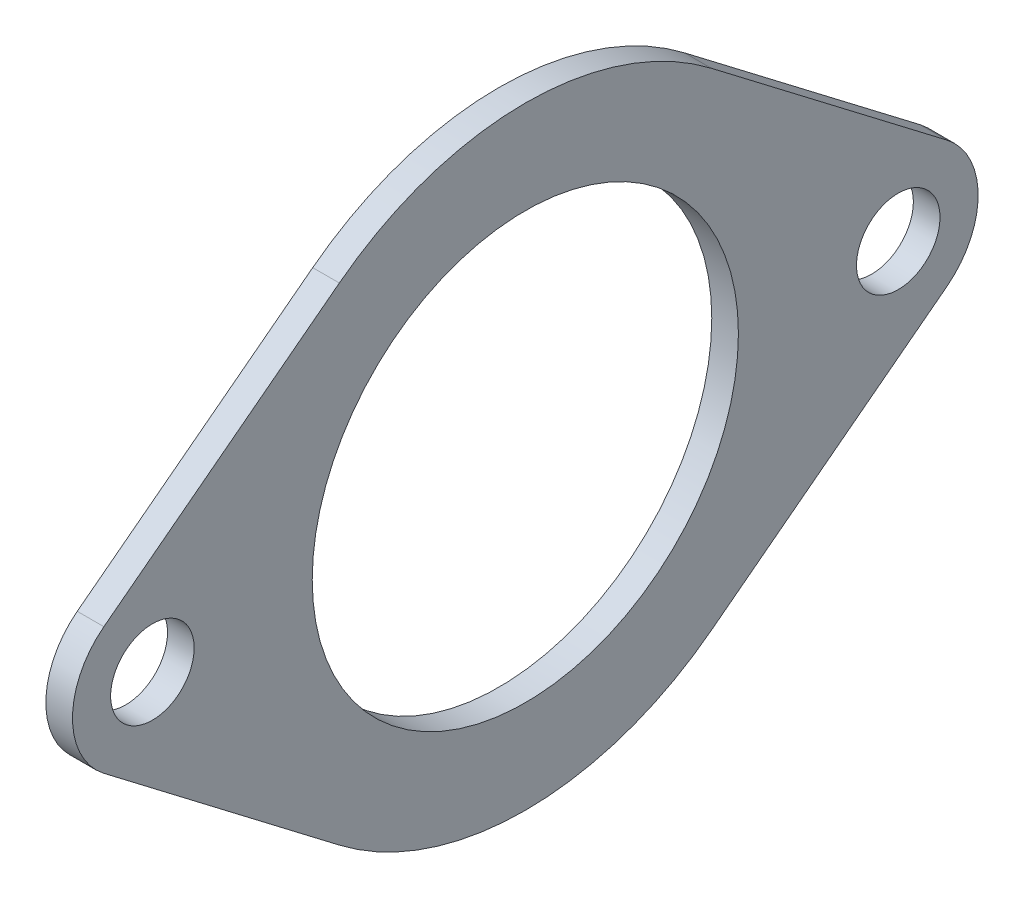
ISO-10303-21;
HEADER;
FILE_DESCRIPTION(('STEP AP214'),'2;1');
FILE_NAME('part.step','',(''),(''),'','','');
FILE_SCHEMA(('AUTOMOTIVE_DESIGN { 1 0 10303 214 1 1 1 1 }'));
ENDSEC;
DATA;
#1=APPLICATION_CONTEXT('core data for automotive mechanical design processes');
#2=APPLICATION_PROTOCOL_DEFINITION('international standard','automotive_design',2000,#1);
#3=PRODUCT_CONTEXT('',#1,'mechanical');
#4=PRODUCT('Part','Part','',(#3));
#5=PRODUCT_RELATED_PRODUCT_CATEGORY('part','',(#4));
#6=PRODUCT_DEFINITION_FORMATION('','',#4);
#7=PRODUCT_DEFINITION_CONTEXT('part definition',#1,'design');
#8=PRODUCT_DEFINITION('design','',#6,#7);
#9=PRODUCT_DEFINITION_SHAPE('','',#8);
#10=(LENGTH_UNIT() NAMED_UNIT(*) SI_UNIT(.MILLI.,.METRE.));
#11=(NAMED_UNIT(*) PLANE_ANGLE_UNIT() SI_UNIT($,.RADIAN.));
#12=(NAMED_UNIT(*) SI_UNIT($,.STERADIAN.) SOLID_ANGLE_UNIT());
#13=UNCERTAINTY_MEASURE_WITH_UNIT(LENGTH_MEASURE(1.E-05),#10,'distance_accuracy_value','');
#14=(GEOMETRIC_REPRESENTATION_CONTEXT(3) GLOBAL_UNCERTAINTY_ASSIGNED_CONTEXT((#13)) GLOBAL_UNIT_ASSIGNED_CONTEXT((#10,
#11,#12)) REPRESENTATION_CONTEXT('',''));
#15=CARTESIAN_POINT('',(0.,0.,0.));
#16=DIRECTION('',(0.,0.,1.));
#17=DIRECTION('',(1.,0.,0.));
#18=AXIS2_PLACEMENT_3D('',#15,#16,#17);
#19=CARTESIAN_POINT('',(0.79375,0.,22.225));
#20=DIRECTION('',(1.,0.,0.));
#21=DIRECTION('',(0.,0.,-1.));
#22=AXIS2_PLACEMENT_3D('',#19,#20,#21);
#23=PLANE('',#22);
#24=CARTESIAN_POINT('',(0.79375,0.,-22.225));
#25=DIRECTION('',(1.,0.,0.));
#26=DIRECTION('',(0.,0.,-1.));
#27=AXIS2_PLACEMENT_3D('',#24,#25,#26);
#28=CIRCLE('',#27,2.4892);
#29=CARTESIAN_POINT('',(0.79375,0.,-24.7142));
#30=VERTEX_POINT('',#29);
#31=EDGE_CURVE('E186',#30,#30,#28,.T.);
#32=ORIENTED_EDGE('',*,*,#31,.F.);
#33=EDGE_LOOP('',(#32));
#34=FACE_BOUND('',#33,.T.);
#35=CARTESIAN_POINT('',(0.79375,0.,22.225));
#36=DIRECTION('',(1.,0.,0.));
#37=DIRECTION('',(0.,0.,-1.));
#38=AXIS2_PLACEMENT_3D('',#35,#36,#37);
#39=CIRCLE('',#38,4.7625);
#40=CARTESIAN_POINT('',(0.79375,3.7842477101564,25.1165178571429));
#41=VERTEX_POINT('',#40);
#42=CARTESIAN_POINT('',(0.79375,-3.78424771015641,25.1165178571429));
#43=VERTEX_POINT('',#42);
#44=EDGE_CURVE('E149',#41,#43,#39,.T.);
#45=ORIENTED_EDGE('',*,*,#44,.T.);
#46=DIRECTION('',(0.,-0.607142857142857,-0.794592695045964));
#47=VECTOR('',#46,1.);
#48=CARTESIAN_POINT('',(0.79375,-3.78424771015641,25.1165178571429));
#49=LINE('',#48,#47);
#50=CARTESIAN_POINT('',(0.79375,-14.5062828889329,11.0841517857143));
#51=VERTEX_POINT('',#50);
#52=EDGE_CURVE('E97',#43,#51,#49,.T.);
#53=ORIENTED_EDGE('',*,*,#52,.T.);
#54=CARTESIAN_POINT('',(0.79375,0.,0.));
#55=DIRECTION('',(1.,0.,0.));
#56=DIRECTION('',(0.,0.,-1.));
#57=AXIS2_PLACEMENT_3D('',#54,#55,#56);
#58=CIRCLE('',#57,18.25625);
#59=CARTESIAN_POINT('',(0.79375,-14.5062828889329,-11.0841517857143));
#60=VERTEX_POINT('',#59);
#61=EDGE_CURVE('E164',#51,#60,#58,.T.);
#62=ORIENTED_EDGE('',*,*,#61,.T.);
#63=DIRECTION('',(0.,0.607142857142857,-0.794592695045964));
#64=VECTOR('',#63,1.);
#65=CARTESIAN_POINT('',(0.79375,-3.78424771015639,-25.1165178571429));
#66=LINE('',#65,#64);
#67=CARTESIAN_POINT('',(0.79375,-3.78424771015639,-25.1165178571429));
#68=VERTEX_POINT('',#67);
#69=EDGE_CURVE('E177',#60,#68,#66,.T.);
#70=ORIENTED_EDGE('',*,*,#69,.T.);
#71=CARTESIAN_POINT('',(0.79375,0.,-22.225));
#72=DIRECTION('',(1.,0.,0.));
#73=DIRECTION('',(0.,0.,-1.));
#74=AXIS2_PLACEMENT_3D('',#71,#72,#73);
#75=CIRCLE('',#74,4.7625);
#76=CARTESIAN_POINT('',(0.79375,3.78424771015641,-25.1165178571429));
#77=VERTEX_POINT('',#76);
#78=EDGE_CURVE('E116',#68,#77,#75,.T.);
#79=ORIENTED_EDGE('',*,*,#78,.T.);
#80=DIRECTION('',(0.,0.607142857142857,0.794592695045964));
#81=VECTOR('',#80,1.);
#82=CARTESIAN_POINT('',(0.79375,3.78424771015641,-25.1165178571429));
#83=LINE('',#82,#81);
#84=CARTESIAN_POINT('',(0.79375,14.5062828889329,-11.0841517857143));
#85=VERTEX_POINT('',#84);
#86=EDGE_CURVE('E110',#77,#85,#83,.T.);
#87=ORIENTED_EDGE('',*,*,#86,.T.);
#88=CARTESIAN_POINT('',(0.79375,0.,0.));
#89=DIRECTION('',(1.,0.,0.));
#90=DIRECTION('',(0.,0.,-1.));
#91=AXIS2_PLACEMENT_3D('',#88,#89,#90);
#92=CIRCLE('',#91,18.25625);
#93=CARTESIAN_POINT('',(0.79375,14.5062828889329,11.0841517857143));
#94=VERTEX_POINT('',#93);
#95=EDGE_CURVE('E114',#85,#94,#92,.T.);
#96=ORIENTED_EDGE('',*,*,#95,.T.);
#97=DIRECTION('',(0.,-0.607142857142857,0.794592695045964));
#98=VECTOR('',#97,1.);
#99=CARTESIAN_POINT('',(0.79375,3.7842477101564,25.1165178571429));
#100=LINE('',#99,#98);
#101=EDGE_CURVE('E54',#94,#41,#100,.T.);
#102=ORIENTED_EDGE('',*,*,#101,.T.);
#103=EDGE_LOOP('',(#45,#53,#62,#70,#79,#87,#96,#102));
#104=FACE_BOUND('',#103,.T.);
#105=CARTESIAN_POINT('',(0.79375,0.,0.));
#106=DIRECTION('',(1.,0.,0.));
#107=DIRECTION('',(0.,0.,-1.));
#108=AXIS2_PLACEMENT_3D('',#105,#106,#107);
#109=CIRCLE('',#108,12.7);
#110=CARTESIAN_POINT('',(0.79375,0.,-12.7));
#111=VERTEX_POINT('',#110);
#112=EDGE_CURVE('E138',#111,#111,#109,.T.);
#113=ORIENTED_EDGE('',*,*,#112,.F.);
#114=EDGE_LOOP('',(#113));
#115=FACE_BOUND('',#114,.T.);
#116=CARTESIAN_POINT('',(0.79375,0.,22.225));
#117=DIRECTION('',(1.,0.,0.));
#118=DIRECTION('',(0.,0.,-1.));
#119=AXIS2_PLACEMENT_3D('',#116,#117,#118);
#120=CIRCLE('',#119,2.4892);
#121=CARTESIAN_POINT('',(0.79375,0.,19.7358));
#122=VERTEX_POINT('',#121);
#123=EDGE_CURVE('E192',#122,#122,#120,.T.);
#124=ORIENTED_EDGE('',*,*,#123,.F.);
#125=EDGE_LOOP('',(#124));
#126=FACE_BOUND('',#125,.T.);
#127=ADVANCED_FACE('F37',(#34,#104,#115,#126),#23,.T.);
#128=CARTESIAN_POINT('',(-0.79375,0.,22.225));
#129=DIRECTION('',(1.,0.,0.));
#130=DIRECTION('',(0.,0.,-1.));
#131=AXIS2_PLACEMENT_3D('',#128,#129,#130);
#132=PLANE('',#131);
#133=CARTESIAN_POINT('',(-0.79375,0.,22.225));
#134=DIRECTION('',(1.,0.,0.));
#135=DIRECTION('',(0.,0.,-1.));
#136=AXIS2_PLACEMENT_3D('',#133,#134,#135);
#137=CIRCLE('',#136,4.7625);
#138=CARTESIAN_POINT('',(-0.79375,3.7842477101564,25.1165178571429));
#139=VERTEX_POINT('',#138);
#140=CARTESIAN_POINT('',(-0.79375,-3.78424771015641,25.1165178571429));
#141=VERTEX_POINT('',#140);
#142=EDGE_CURVE('E134',#139,#141,#137,.T.);
#143=ORIENTED_EDGE('',*,*,#142,.F.);
#144=DIRECTION('',(0.,-0.607142857142857,0.794592695045964));
#145=VECTOR('',#144,1.);
#146=CARTESIAN_POINT('',(-0.79375,3.7842477101564,25.1165178571429));
#147=LINE('',#146,#145);
#148=CARTESIAN_POINT('',(-0.79375,14.5062828889329,11.0841517857143));
#149=VERTEX_POINT('',#148);
#150=EDGE_CURVE('E89',#149,#139,#147,.T.);
#151=ORIENTED_EDGE('',*,*,#150,.F.);
#152=CARTESIAN_POINT('',(-0.79375,0.,0.));
#153=DIRECTION('',(1.,0.,0.));
#154=DIRECTION('',(0.,0.,-1.));
#155=AXIS2_PLACEMENT_3D('',#152,#153,#154);
#156=CIRCLE('',#155,18.25625);
#157=CARTESIAN_POINT('',(-0.79375,14.5062828889329,-11.0841517857143));
#158=VERTEX_POINT('',#157);
#159=EDGE_CURVE('E83',#158,#149,#156,.T.);
#160=ORIENTED_EDGE('',*,*,#159,.F.);
#161=DIRECTION('',(0.,0.607142857142857,0.794592695045964));
#162=VECTOR('',#161,1.);
#163=CARTESIAN_POINT('',(-0.79375,3.78424771015641,-25.1165178571429));
#164=LINE('',#163,#162);
#165=CARTESIAN_POINT('',(-0.79375,3.78424771015641,-25.1165178571429));
#166=VERTEX_POINT('',#165);
#167=EDGE_CURVE('E124',#166,#158,#164,.T.);
#168=ORIENTED_EDGE('',*,*,#167,.F.);
#169=CARTESIAN_POINT('',(-0.79375,0.,-22.225));
#170=DIRECTION('',(1.,0.,0.));
#171=DIRECTION('',(0.,0.,-1.));
#172=AXIS2_PLACEMENT_3D('',#169,#170,#171);
#173=CIRCLE('',#172,4.7625);
#174=CARTESIAN_POINT('',(-0.79375,-3.78424771015639,-25.1165178571429));
#175=VERTEX_POINT('',#174);
#176=EDGE_CURVE('E144',#175,#166,#173,.T.);
#177=ORIENTED_EDGE('',*,*,#176,.F.);
#178=DIRECTION('',(0.,0.607142857142857,-0.794592695045964));
#179=VECTOR('',#178,1.);
#180=CARTESIAN_POINT('',(-0.79375,-3.78424771015639,-25.1165178571429));
#181=LINE('',#180,#179);
#182=CARTESIAN_POINT('',(-0.79375,-14.5062828889329,-11.0841517857143));
#183=VERTEX_POINT('',#182);
#184=EDGE_CURVE('E142',#183,#175,#181,.T.);
#185=ORIENTED_EDGE('',*,*,#184,.F.);
#186=CARTESIAN_POINT('',(-0.79375,0.,0.));
#187=DIRECTION('',(1.,0.,0.));
#188=DIRECTION('',(0.,0.,-1.));
#189=AXIS2_PLACEMENT_3D('',#186,#187,#188);
#190=CIRCLE('',#189,18.25625);
#191=CARTESIAN_POINT('',(-0.79375,-14.5062828889329,11.0841517857143));
#192=VERTEX_POINT('',#191);
#193=EDGE_CURVE('E140',#192,#183,#190,.T.);
#194=ORIENTED_EDGE('',*,*,#193,.F.);
#195=DIRECTION('',(0.,-0.607142857142857,-0.794592695045964));
#196=VECTOR('',#195,1.);
#197=CARTESIAN_POINT('',(-0.79375,-3.78424771015641,25.1165178571429));
#198=LINE('',#197,#196);
#199=EDGE_CURVE('E137',#141,#192,#198,.T.);
#200=ORIENTED_EDGE('',*,*,#199,.F.);
#201=EDGE_LOOP('',(#143,#151,#160,#168,#177,#185,#194,#200));
#202=FACE_BOUND('',#201,.T.);
#203=CARTESIAN_POINT('',(-0.79375,0.,0.));
#204=DIRECTION('',(1.,0.,0.));
#205=DIRECTION('',(0.,0.,-1.));
#206=AXIS2_PLACEMENT_3D('',#203,#204,#205);
#207=CIRCLE('',#206,12.7);
#208=CARTESIAN_POINT('',(-0.79375,0.,-12.7));
#209=VERTEX_POINT('',#208);
#210=EDGE_CURVE('E183',#209,#209,#207,.T.);
#211=ORIENTED_EDGE('',*,*,#210,.T.);
#212=EDGE_LOOP('',(#211));
#213=FACE_BOUND('',#212,.T.);
#214=CARTESIAN_POINT('',(-0.79375,0.,-22.225));
#215=DIRECTION('',(1.,0.,0.));
#216=DIRECTION('',(0.,0.,-1.));
#217=AXIS2_PLACEMENT_3D('',#214,#215,#216);
#218=CIRCLE('',#217,2.4892);
#219=CARTESIAN_POINT('',(-0.79375,0.,-24.7142));
#220=VERTEX_POINT('',#219);
#221=EDGE_CURVE('E189',#220,#220,#218,.T.);
#222=ORIENTED_EDGE('',*,*,#221,.T.);
#223=EDGE_LOOP('',(#222));
#224=FACE_BOUND('',#223,.T.);
#225=CARTESIAN_POINT('',(-0.79375,0.,22.225));
#226=DIRECTION('',(1.,0.,0.));
#227=DIRECTION('',(0.,0.,-1.));
#228=AXIS2_PLACEMENT_3D('',#225,#226,#227);
#229=CIRCLE('',#228,2.4892);
#230=CARTESIAN_POINT('',(-0.79375,0.,19.7358));
#231=VERTEX_POINT('',#230);
#232=EDGE_CURVE('E195',#231,#231,#229,.T.);
#233=ORIENTED_EDGE('',*,*,#232,.T.);
#234=EDGE_LOOP('',(#233));
#235=FACE_BOUND('',#234,.T.);
#236=ADVANCED_FACE('F168',(#202,#213,#224,#235),#132,.F.);
#237=CARTESIAN_POINT('',(0.79375,0.,22.225));
#238=DIRECTION('',(-1.,0.,0.));
#239=DIRECTION('',(0.,0.,1.));
#240=AXIS2_PLACEMENT_3D('',#237,#238,#239);
#241=CYLINDRICAL_SURFACE('',#240,4.7625);
#242=ORIENTED_EDGE('',*,*,#142,.T.);
#243=DIRECTION('',(-1.,0.,0.));
#244=VECTOR('',#243,1.);
#245=CARTESIAN_POINT('',(0.79375,-3.78424771015641,25.1165178571429));
#246=LINE('',#245,#244);
#247=EDGE_CURVE('E11',#43,#141,#246,.T.);
#248=ORIENTED_EDGE('',*,*,#247,.F.);
#249=ORIENTED_EDGE('',*,*,#44,.F.);
#250=DIRECTION('',(-1.,0.,0.));
#251=VECTOR('',#250,1.);
#252=CARTESIAN_POINT('',(0.79375,3.7842477101564,25.1165178571429));
#253=LINE('',#252,#251);
#254=EDGE_CURVE('E130',#41,#139,#253,.T.);
#255=ORIENTED_EDGE('',*,*,#254,.T.);
#256=EDGE_LOOP('',(#242,#248,#249,#255));
#257=FACE_BOUND('',#256,.T.);
#258=ADVANCED_FACE('F39',(#257),#241,.T.);
#259=CARTESIAN_POINT('',(0.79375,-3.78424771015641,25.1165178571429));
#260=DIRECTION('',(0.,0.794592695045964,-0.607142857142857));
#261=DIRECTION('',(0.,0.607142857142857,0.794592695045964));
#262=AXIS2_PLACEMENT_3D('',#259,#260,#261);
#263=PLANE('',#262);
#264=ORIENTED_EDGE('',*,*,#199,.T.);
#265=DIRECTION('',(-1.,0.,0.));
#266=VECTOR('',#265,1.);
#267=CARTESIAN_POINT('',(0.79375,-14.5062828889329,11.0841517857143));
#268=LINE('',#267,#266);
#269=EDGE_CURVE('E46',#51,#192,#268,.T.);
#270=ORIENTED_EDGE('',*,*,#269,.F.);
#271=ORIENTED_EDGE('',*,*,#52,.F.);
#272=ORIENTED_EDGE('',*,*,#247,.T.);
#273=EDGE_LOOP('',(#264,#270,#271,#272));
#274=FACE_BOUND('',#273,.T.);
#275=ADVANCED_FACE('F228',(#274),#263,.F.);
#276=CARTESIAN_POINT('',(0.79375,0.,0.));
#277=DIRECTION('',(-1.,0.,0.));
#278=DIRECTION('',(0.,0.,1.));
#279=AXIS2_PLACEMENT_3D('',#276,#277,#278);
#280=CYLINDRICAL_SURFACE('',#279,18.25625);
#281=ORIENTED_EDGE('',*,*,#193,.T.);
#282=DIRECTION('',(-1.,0.,0.));
#283=VECTOR('',#282,1.);
#284=CARTESIAN_POINT('',(0.79375,-14.5062828889329,-11.0841517857143));
#285=LINE('',#284,#283);
#286=EDGE_CURVE('E156',#60,#183,#285,.T.);
#287=ORIENTED_EDGE('',*,*,#286,.F.);
#288=ORIENTED_EDGE('',*,*,#61,.F.);
#289=ORIENTED_EDGE('',*,*,#269,.T.);
#290=EDGE_LOOP('',(#281,#287,#288,#289));
#291=FACE_BOUND('',#290,.T.);
#292=ADVANCED_FACE('F162',(#291),#280,.T.);
#293=CARTESIAN_POINT('',(0.79375,-3.78424771015639,-25.1165178571429));
#294=DIRECTION('',(0.,0.794592695045964,0.607142857142857));
#295=DIRECTION('',(0.,-0.607142857142857,0.794592695045964));
#296=AXIS2_PLACEMENT_3D('',#293,#294,#295);
#297=PLANE('',#296);
#298=ORIENTED_EDGE('',*,*,#184,.T.);
#299=DIRECTION('',(-1.,0.,0.));
#300=VECTOR('',#299,1.);
#301=CARTESIAN_POINT('',(0.79375,-3.78424771015639,-25.1165178571429));
#302=LINE('',#301,#300);
#303=EDGE_CURVE('E153',#68,#175,#302,.T.);
#304=ORIENTED_EDGE('',*,*,#303,.F.);
#305=ORIENTED_EDGE('',*,*,#69,.F.);
#306=ORIENTED_EDGE('',*,*,#286,.T.);
#307=EDGE_LOOP('',(#298,#304,#305,#306));
#308=FACE_BOUND('',#307,.T.);
#309=ADVANCED_FACE('F173',(#308),#297,.F.);
#310=CARTESIAN_POINT('',(0.79375,0.,-22.225));
#311=DIRECTION('',(-1.,0.,0.));
#312=DIRECTION('',(0.,0.,1.));
#313=AXIS2_PLACEMENT_3D('',#310,#311,#312);
#314=CYLINDRICAL_SURFACE('',#313,4.7625);
#315=ORIENTED_EDGE('',*,*,#176,.T.);
#316=DIRECTION('',(-1.,0.,0.));
#317=VECTOR('',#316,1.);
#318=CARTESIAN_POINT('',(0.79375,3.78424771015641,-25.1165178571429));
#319=LINE('',#318,#317);
#320=EDGE_CURVE('E125',#77,#166,#319,.T.);
#321=ORIENTED_EDGE('',*,*,#320,.F.);
#322=ORIENTED_EDGE('',*,*,#78,.F.);
#323=ORIENTED_EDGE('',*,*,#303,.T.);
#324=EDGE_LOOP('',(#315,#321,#322,#323));
#325=FACE_BOUND('',#324,.T.);
#326=ADVANCED_FACE('F176',(#325),#314,.T.);
#327=CARTESIAN_POINT('',(0.79375,3.78424771015641,-25.1165178571429));
#328=DIRECTION('',(0.,-0.794592695045964,0.607142857142857));
#329=DIRECTION('',(0.,-0.607142857142857,-0.794592695045964));
#330=AXIS2_PLACEMENT_3D('',#327,#328,#329);
#331=PLANE('',#330);
#332=ORIENTED_EDGE('',*,*,#167,.T.);
#333=DIRECTION('',(-1.,0.,0.));
#334=VECTOR('',#333,1.);
#335=CARTESIAN_POINT('',(0.79375,14.5062828889329,-11.0841517857143));
#336=LINE('',#335,#334);
#337=EDGE_CURVE('E121',#85,#158,#336,.T.);
#338=ORIENTED_EDGE('',*,*,#337,.F.);
#339=ORIENTED_EDGE('',*,*,#86,.F.);
#340=ORIENTED_EDGE('',*,*,#320,.T.);
#341=EDGE_LOOP('',(#332,#338,#339,#340));
#342=FACE_BOUND('',#341,.T.);
#343=ADVANCED_FACE('F122',(#342),#331,.F.);
#344=CARTESIAN_POINT('',(0.79375,0.,0.));
#345=DIRECTION('',(-1.,0.,0.));
#346=DIRECTION('',(0.,0.,1.));
#347=AXIS2_PLACEMENT_3D('',#344,#345,#346);
#348=CYLINDRICAL_SURFACE('',#347,18.25625);
#349=ORIENTED_EDGE('',*,*,#159,.T.);
#350=DIRECTION('',(-1.,0.,0.));
#351=VECTOR('',#350,1.);
#352=CARTESIAN_POINT('',(0.79375,14.5062828889329,11.0841517857143));
#353=LINE('',#352,#351);
#354=EDGE_CURVE('E126',#94,#149,#353,.T.);
#355=ORIENTED_EDGE('',*,*,#354,.F.);
#356=ORIENTED_EDGE('',*,*,#95,.F.);
#357=ORIENTED_EDGE('',*,*,#337,.T.);
#358=EDGE_LOOP('',(#349,#355,#356,#357));
#359=FACE_BOUND('',#358,.T.);
#360=ADVANCED_FACE('F128',(#359),#348,.T.);
#361=CARTESIAN_POINT('',(0.79375,3.7842477101564,25.1165178571429));
#362=DIRECTION('',(0.,-0.794592695045964,-0.607142857142857));
#363=DIRECTION('',(0.,0.607142857142857,-0.794592695045964));
#364=AXIS2_PLACEMENT_3D('',#361,#362,#363);
#365=PLANE('',#364);
#366=ORIENTED_EDGE('',*,*,#150,.T.);
#367=ORIENTED_EDGE('',*,*,#254,.F.);
#368=ORIENTED_EDGE('',*,*,#101,.F.);
#369=ORIENTED_EDGE('',*,*,#354,.T.);
#370=EDGE_LOOP('',(#366,#367,#368,#369));
#371=FACE_BOUND('',#370,.T.);
#372=ADVANCED_FACE('F216',(#371),#365,.F.);
#373=CARTESIAN_POINT('',(0.79375,0.,0.));
#374=DIRECTION('',(-1.,0.,0.));
#375=DIRECTION('',(0.,0.,1.));
#376=AXIS2_PLACEMENT_3D('',#373,#374,#375);
#377=CYLINDRICAL_SURFACE('',#376,12.7);
#378=ORIENTED_EDGE('',*,*,#112,.T.);
#379=EDGE_LOOP('',(#378));
#380=FACE_BOUND('',#379,.T.);
#381=ORIENTED_EDGE('',*,*,#210,.F.);
#382=EDGE_LOOP('',(#381));
#383=FACE_BOUND('',#382,.T.);
#384=ADVANCED_FACE('F213',(#380,#383),#377,.F.);
#385=CARTESIAN_POINT('',(0.79375,0.,-22.225));
#386=DIRECTION('',(-1.,0.,0.));
#387=DIRECTION('',(0.,0.,1.));
#388=AXIS2_PLACEMENT_3D('',#385,#386,#387);
#389=CYLINDRICAL_SURFACE('',#388,2.4892);
#390=ORIENTED_EDGE('',*,*,#31,.T.);
#391=EDGE_LOOP('',(#390));
#392=FACE_BOUND('',#391,.T.);
#393=ORIENTED_EDGE('',*,*,#221,.F.);
#394=EDGE_LOOP('',(#393));
#395=FACE_BOUND('',#394,.T.);
#396=ADVANCED_FACE('F304',(#392,#395),#389,.F.);
#397=CARTESIAN_POINT('',(0.79375,0.,22.225));
#398=DIRECTION('',(-1.,0.,0.));
#399=DIRECTION('',(0.,0.,1.));
#400=AXIS2_PLACEMENT_3D('',#397,#398,#399);
#401=CYLINDRICAL_SURFACE('',#400,2.4892);
#402=ORIENTED_EDGE('',*,*,#123,.T.);
#403=EDGE_LOOP('',(#402));
#404=FACE_BOUND('',#403,.T.);
#405=ORIENTED_EDGE('',*,*,#232,.F.);
#406=EDGE_LOOP('',(#405));
#407=FACE_BOUND('',#406,.T.);
#408=ADVANCED_FACE('F201',(#404,#407),#401,.F.);
#409=CLOSED_SHELL('',(#127,#236,#258,#275,#292,#309,#326,#343,#360,#372,#384,#396,#408));
#410=MANIFOLD_SOLID_BREP('B2',#409);
#411=ADVANCED_BREP_SHAPE_REPRESENTATION('',(#18,#410),#14);
#412=SHAPE_DEFINITION_REPRESENTATION(#9,#411);
ENDSEC;
END-ISO-10303-21;
